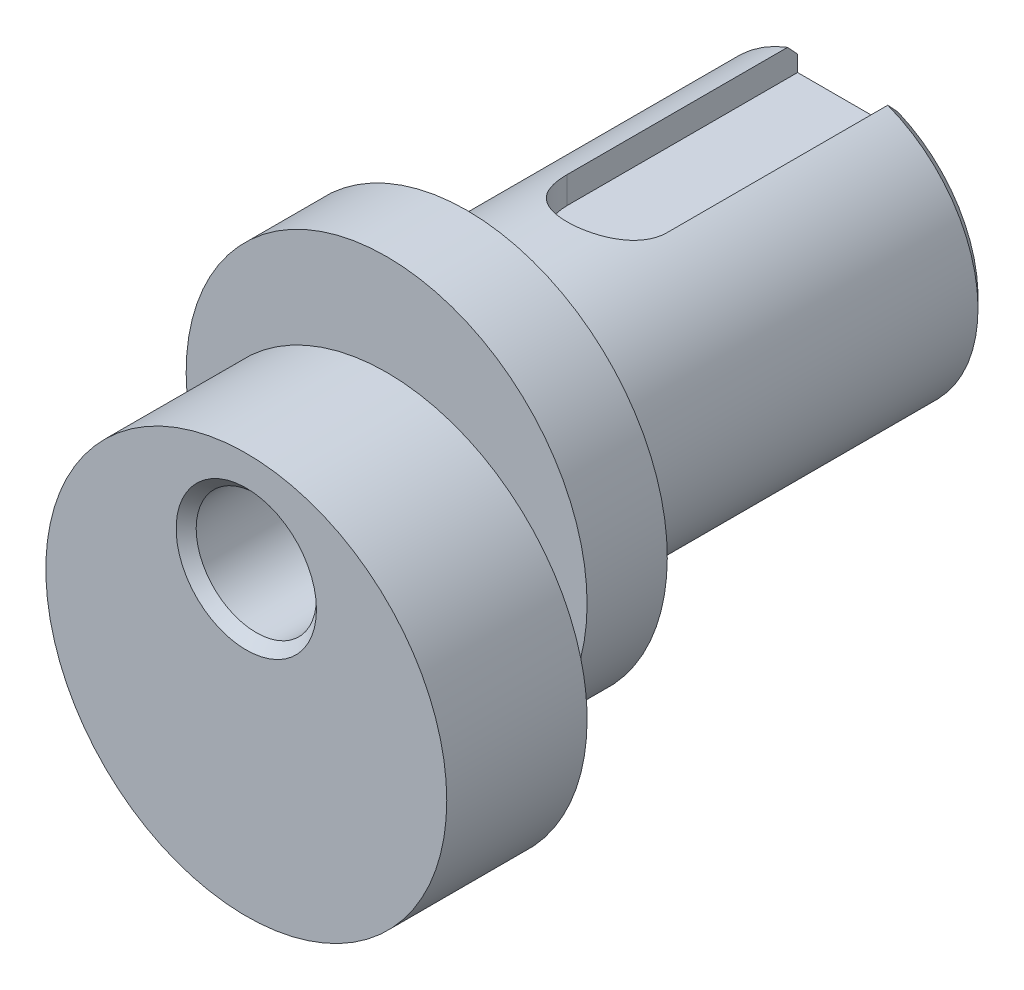
ISO-10303-21;
HEADER;
FILE_DESCRIPTION(('STEP AP214'),'2;1');
FILE_NAME('part.step','',(''),(''),'','','');
FILE_SCHEMA(('AUTOMOTIVE_DESIGN { 1 0 10303 214 1 1 1 1 }'));
ENDSEC;
DATA;
#1=APPLICATION_CONTEXT('core data for automotive mechanical design processes');
#2=APPLICATION_PROTOCOL_DEFINITION('international standard','automotive_design',2000,#1);
#3=PRODUCT_CONTEXT('',#1,'mechanical');
#4=PRODUCT('Part','Part','',(#3));
#5=PRODUCT_RELATED_PRODUCT_CATEGORY('part','',(#4));
#6=PRODUCT_DEFINITION_FORMATION('','',#4);
#7=PRODUCT_DEFINITION_CONTEXT('part definition',#1,'design');
#8=PRODUCT_DEFINITION('design','',#6,#7);
#9=PRODUCT_DEFINITION_SHAPE('','',#8);
#10=(LENGTH_UNIT() NAMED_UNIT(*) SI_UNIT(.MILLI.,.METRE.));
#11=(NAMED_UNIT(*) PLANE_ANGLE_UNIT() SI_UNIT($,.RADIAN.));
#12=(NAMED_UNIT(*) SI_UNIT($,.STERADIAN.) SOLID_ANGLE_UNIT());
#13=UNCERTAINTY_MEASURE_WITH_UNIT(LENGTH_MEASURE(1.E-05),#10,'distance_accuracy_value','');
#14=(GEOMETRIC_REPRESENTATION_CONTEXT(3) GLOBAL_UNCERTAINTY_ASSIGNED_CONTEXT((#13)) GLOBAL_UNIT_ASSIGNED_CONTEXT((#10,
#11,#12)) REPRESENTATION_CONTEXT('',''));
#15=CARTESIAN_POINT('',(0.,0.,0.));
#16=DIRECTION('',(0.,0.,1.));
#17=DIRECTION('',(1.,0.,0.));
#18=AXIS2_PLACEMENT_3D('',#15,#16,#17);
#19=CARTESIAN_POINT('',(0.,5.,-30.));
#20=DIRECTION('',(0.,0.,1.));
#21=DIRECTION('',(1.,0.,0.));
#22=AXIS2_PLACEMENT_3D('',#19,#20,#21);
#23=CYLINDRICAL_SURFACE('',#22,7.);
#24=CARTESIAN_POINT('',(0.,5.,-11.));
#25=DIRECTION('',(0.,0.,-1.));
#26=DIRECTION('',(-1.,0.,0.));
#27=AXIS2_PLACEMENT_3D('',#24,#25,#26);
#28=CIRCLE('',#27,7.);
#29=CARTESIAN_POINT('',(-7.,5.,-11.));
#30=VERTEX_POINT('',#29);
#31=EDGE_CURVE('E125',#30,#30,#28,.T.);
#32=ORIENTED_EDGE('',*,*,#31,.T.);
#33=EDGE_LOOP('',(#32));
#34=FACE_BOUND('',#33,.T.);
#35=DIRECTION('',(0.,0.,1.));
#36=VECTOR('',#35,1.);
#37=CARTESIAN_POINT('',(-2.5,11.538348415311,-30.));
#38=LINE('',#37,#36);
#39=CARTESIAN_POINT('',(-2.5,11.538348415311,-29.5));
#40=VERTEX_POINT('',#39);
#41=CARTESIAN_POINT('',(-2.5,11.538348415311,-18.5));
#42=VERTEX_POINT('',#41);
#43=EDGE_CURVE('E99',#40,#42,#38,.T.);
#44=ORIENTED_EDGE('',*,*,#43,.F.);
#45=CARTESIAN_POINT('',(0.,5.,-29.5));
#46=DIRECTION('',(0.,0.,-1.));
#47=DIRECTION('',(-1.,0.,0.));
#48=AXIS2_PLACEMENT_3D('',#45,#46,#47);
#49=CIRCLE('',#48,7.);
#50=CARTESIAN_POINT('',(2.5,11.538348415311,-29.5));
#51=VERTEX_POINT('',#50);
#52=EDGE_CURVE('E56',#40,#51,#49,.F.);
#53=ORIENTED_EDGE('',*,*,#52,.T.);
#54=DIRECTION('',(0.,0.,1.));
#55=VECTOR('',#54,1.);
#56=CARTESIAN_POINT('',(2.5,11.538348415311,-30.));
#57=LINE('',#56,#55);
#58=CARTESIAN_POINT('',(2.5,11.538348415311,-18.5));
#59=VERTEX_POINT('',#58);
#60=EDGE_CURVE('E102',#59,#51,#57,.F.);
#61=ORIENTED_EDGE('',*,*,#60,.F.);
#62=CARTESIAN_POINT('',(-2.5,11.538348415311,-18.5));
#63=CARTESIAN_POINT('',(-2.50000932220903,11.5383365378513,-18.4321107542711));
#64=CARTESIAN_POINT('',(-2.49723485076694,11.5394054992274,-18.3642280673609));
#65=CARTESIAN_POINT('',(-2.4861910211816,11.5436165747813,-18.2289960893886));
#66=CARTESIAN_POINT('',(-2.47792334551208,11.5467580541806,-18.1616466413939));
#67=CARTESIAN_POINT('',(-2.456001752859,11.5550121763794,-18.0281785853972));
#68=CARTESIAN_POINT('',(-2.44236559963955,11.5601183170568,-17.9620566636602));
#69=CARTESIAN_POINT('',(-2.40985115466648,11.5721317785417,-17.8312981648915));
#70=CARTESIAN_POINT('',(-2.39097263107435,11.5790391790075,-17.7666616536876));
#71=CARTESIAN_POINT('',(-2.32673964179204,11.6021493436571,-17.5757356335225));
#72=CARTESIAN_POINT('',(-2.27375112606986,11.6207547534084,-17.4522095478644));
#73=CARTESIAN_POINT('',(-2.14910757865425,11.6622539736071,-17.215769666872));
#74=CARTESIAN_POINT('',(-2.07743895048849,11.6851509042488,-17.1028636832645));
#75=CARTESIAN_POINT('',(-1.9140257110197,11.7337991379222,-16.8857847866473));
#76=CARTESIAN_POINT('',(-1.82158337146744,11.7596286404137,-16.7821535248041));
#77=CARTESIAN_POINT('',(-1.6207338877633,11.8105759232303,-16.5914912952836));
#78=CARTESIAN_POINT('',(-1.51232377552673,11.8356935701987,-16.5044634207567));
#79=CARTESIAN_POINT('',(-1.27853915335934,11.8833113327905,-16.346910144545));
#80=CARTESIAN_POINT('',(-1.15274833789185,11.905708352238,-16.2769684781395));
#81=CARTESIAN_POINT('',(-0.890250825476634,11.9444235767263,-16.1594633532026));
#82=CARTESIAN_POINT('',(-0.753547890540326,11.9607438658547,-16.111892220954));
#83=CARTESIAN_POINT('',(-0.478829979256174,11.9849105051071,-16.0423593978176));
#84=CARTESIAN_POINT('',(-0.341079835227466,11.9930659435251,-16.0194608695289));
#85=CARTESIAN_POINT('',(-0.0634643052969033,12.0010879805382,-15.9969315972224));
#86=CARTESIAN_POINT('',(0.0764004845074484,12.000956873027,-15.9972944139654));
#87=CARTESIAN_POINT('',(0.347593258486945,11.9926225804908,-16.0207112737611));
#88=CARTESIAN_POINT('',(0.47902240707872,11.9847824358352,-16.0427447941985));
#89=CARTESIAN_POINT('',(0.736175812143607,11.9623783250735,-16.1071734241588));
#90=CARTESIAN_POINT('',(0.861899745780464,11.9478139789904,-16.1495696843625));
#91=CARTESIAN_POINT('',(1.10616102429807,11.9131650689037,-16.2540469115653));
#92=CARTESIAN_POINT('',(1.22457279066906,11.8930059216431,-16.3163957149601));
#93=CARTESIAN_POINT('',(1.44953531305523,11.8492335561632,-16.4587793352234));
#94=CARTESIAN_POINT('',(1.5560824517677,11.8256192895926,-16.5388195237836));
#95=CARTESIAN_POINT('',(1.7603244525607,11.7759054780549,-16.7193232636567));
#96=CARTESIAN_POINT('',(1.85724185700418,11.7497405584388,-16.8206497231449));
#97=CARTESIAN_POINT('',(2.03299914621296,11.6989034246898,-17.0383273641656));
#98=CARTESIAN_POINT('',(2.11183255456462,11.6742317476526,-17.1546839051685));
#99=CARTESIAN_POINT('',(2.25049860898459,11.628778038754,-17.401942598522));
#100=CARTESIAN_POINT('',(2.30994207989625,11.6080787511899,-17.5330789755054));
#101=CARTESIAN_POINT('',(2.4055543972585,11.5738821361027,-17.8043648015822));
#102=CARTESIAN_POINT('',(2.44176119399954,11.5603730716505,-17.944499141169));
#103=CARTESIAN_POINT('',(2.47705497148627,11.5470854224556,-18.1550305442642));
#104=CARTESIAN_POINT('',(2.48565347586445,11.5438201096791,-18.2237363017718));
#105=CARTESIAN_POINT('',(2.49712352174882,11.5394491082968,-18.3616151641917));
#106=CARTESIAN_POINT('',(2.50000139665367,11.5383410314094,-18.4307876671005));
#107=CARTESIAN_POINT('',(2.5,11.538348415311,-18.5));
#108=B_SPLINE_CURVE_WITH_KNOTS('',3,(#62,#63,#64,#65,#66,#67,#68,#69,#70,#71,#72,#73,#74,#75,
#76,#77,#78,#79,#80,#81,#82,#83,#84,#85,#86,#87,#88,#89,#90,#91,#92,#93,#94,#95,#96,#97,#98,#99,
#100,#101,#102,#103,#104,#105,#106,#107),.UNSPECIFIED.,.F.,.F.,(4,2,2,2,2,2,2,2,2,2,2,2,2,2,2,2,
2,2,2,2,2,2,4),(0.,0.203591628551589,0.407120929225528,0.609982356545745,0.812852756635989,
1.21793118555512,1.6233052814847,2.0451597231193,2.4670926781184,2.90188398965561,
3.33652604665238,3.75400993940861,4.17137826416922,4.56998920861347,4.96862268086888,
5.37284909448639,5.77719841367921,6.20315837945088,6.62927065674721,7.06347329058504,
7.49696496492444,7.70468580162772,7.91217653896403),.UNSPECIFIED.);
#109=EDGE_CURVE('E145',#42,#59,#108,.T.);
#110=ORIENTED_EDGE('',*,*,#109,.F.);
#111=EDGE_LOOP('',(#44,#53,#61,#110));
#112=FACE_BOUND('',#111,.T.);
#113=ADVANCED_FACE('F40',(#34,#112),#23,.T.);
#114=CARTESIAN_POINT('',(0.,5.,-30.));
#115=DIRECTION('',(0.,0.,-1.));
#116=DIRECTION('',(-1.,0.,0.));
#117=AXIS2_PLACEMENT_3D('',#114,#115,#116);
#118=PLANE('',#117);
#119=CARTESIAN_POINT('',(0.,5.,-30.));
#120=DIRECTION('',(0.,0.,-1.));
#121=DIRECTION('',(-1.,0.,0.));
#122=AXIS2_PLACEMENT_3D('',#119,#120,#121);
#123=CIRCLE('',#122,3.50000000000001);
#124=CARTESIAN_POINT('',(-3.50000000000001,5.,-30.));
#125=VERTEX_POINT('',#124);
#126=EDGE_CURVE('E11',#125,#125,#123,.F.);
#127=ORIENTED_EDGE('',*,*,#126,.T.);
#128=EDGE_LOOP('',(#127));
#129=FACE_BOUND('',#128,.T.);
#130=DIRECTION('',(0.,1.,0.));
#131=VECTOR('',#130,1.);
#132=CARTESIAN_POINT('',(2.5,5.,-30.));
#133=LINE('',#132,#131);
#134=CARTESIAN_POINT('',(2.5,10.2,-30.));
#135=VERTEX_POINT('',#134);
#136=CARTESIAN_POINT('',(2.5,11.,-30.));
#137=VERTEX_POINT('',#136);
#138=EDGE_CURVE('E128',#135,#137,#133,.T.);
#139=ORIENTED_EDGE('',*,*,#138,.T.);
#140=CARTESIAN_POINT('',(0.,5.,-30.));
#141=DIRECTION('',(0.,0.,-1.));
#142=DIRECTION('',(-1.,0.,0.));
#143=AXIS2_PLACEMENT_3D('',#140,#141,#142);
#144=CIRCLE('',#143,6.5);
#145=CARTESIAN_POINT('',(-2.5,11.,-30.));
#146=VERTEX_POINT('',#145);
#147=EDGE_CURVE('E153',#137,#146,#144,.T.);
#148=ORIENTED_EDGE('',*,*,#147,.T.);
#149=DIRECTION('',(0.,-1.,0.));
#150=VECTOR('',#149,1.);
#151=CARTESIAN_POINT('',(-2.5,5.,-30.));
#152=LINE('',#151,#150);
#153=CARTESIAN_POINT('',(-2.5,10.2,-30.));
#154=VERTEX_POINT('',#153);
#155=EDGE_CURVE('E143',#146,#154,#152,.T.);
#156=ORIENTED_EDGE('',*,*,#155,.T.);
#157=DIRECTION('',(-1.,0.,0.));
#158=VECTOR('',#157,1.);
#159=CARTESIAN_POINT('',(2.5,10.2,-30.));
#160=LINE('',#159,#158);
#161=EDGE_CURVE('E116',#135,#154,#160,.T.);
#162=ORIENTED_EDGE('',*,*,#161,.F.);
#163=EDGE_LOOP('',(#139,#148,#156,#162));
#164=FACE_BOUND('',#163,.T.);
#165=ADVANCED_FACE('F168',(#129,#164),#118,.T.);
#166=CARTESIAN_POINT('',(0.,0.,-7.));
#167=DIRECTION('',(0.,0.,1.));
#168=DIRECTION('',(1.,0.,0.));
#169=AXIS2_PLACEMENT_3D('',#166,#167,#168);
#170=CYLINDRICAL_SURFACE('',#169,10.);
#171=CARTESIAN_POINT('',(0.,0.,-7.));
#172=DIRECTION('',(0.,0.,1.));
#173=DIRECTION('',(1.,0.,0.));
#174=AXIS2_PLACEMENT_3D('',#171,#172,#173);
#175=CIRCLE('',#174,10.);
#176=CARTESIAN_POINT('',(9.68245836551854,2.5,-7.));
#177=VERTEX_POINT('',#176);
#178=CARTESIAN_POINT('',(-9.68245836551854,2.5,-7.));
#179=VERTEX_POINT('',#178);
#180=EDGE_CURVE('E129',#177,#179,#175,.T.);
#181=ORIENTED_EDGE('',*,*,#180,.T.);
#182=EDGE_CURVE('E138',#179,#177,#175,.T.);
#183=ORIENTED_EDGE('',*,*,#182,.T.);
#184=EDGE_LOOP('',(#181,#183));
#185=FACE_BOUND('',#184,.T.);
#186=CARTESIAN_POINT('',(0.,0.,0.));
#187=DIRECTION('',(0.,0.,1.));
#188=DIRECTION('',(1.,0.,0.));
#189=AXIS2_PLACEMENT_3D('',#186,#187,#188);
#190=CIRCLE('',#189,10.);
#191=CARTESIAN_POINT('',(10.,0.,0.));
#192=VERTEX_POINT('',#191);
#193=EDGE_CURVE('E133',#192,#192,#190,.T.);
#194=ORIENTED_EDGE('',*,*,#193,.F.);
#195=EDGE_LOOP('',(#194));
#196=FACE_BOUND('',#195,.T.);
#197=ADVANCED_FACE('F186',(#185,#196),#170,.T.);
#198=CARTESIAN_POINT('',(0.,0.,-7.));
#199=DIRECTION('',(0.,0.,1.));
#200=DIRECTION('',(1.,0.,0.));
#201=AXIS2_PLACEMENT_3D('',#198,#199,#200);
#202=PLANE('',#201);
#203=CARTESIAN_POINT('',(0.,5.,-7.));
#204=DIRECTION('',(0.,0.,-1.));
#205=DIRECTION('',(-1.,0.,0.));
#206=AXIS2_PLACEMENT_3D('',#203,#204,#205);
#207=CIRCLE('',#206,10.);
#208=EDGE_CURVE('E134',#177,#179,#207,.T.);
#209=ORIENTED_EDGE('',*,*,#208,.F.);
#210=ORIENTED_EDGE('',*,*,#182,.F.);
#211=EDGE_LOOP('',(#209,#210));
#212=FACE_BOUND('',#211,.T.);
#213=ADVANCED_FACE('F214',(#212),#202,.F.);
#214=CARTESIAN_POINT('',(0.,0.,0.));
#215=DIRECTION('',(0.,0.,1.));
#216=DIRECTION('',(1.,0.,0.));
#217=AXIS2_PLACEMENT_3D('',#214,#215,#216);
#218=PLANE('',#217);
#219=CARTESIAN_POINT('',(0.,5.,0.));
#220=DIRECTION('',(0.,0.,1.));
#221=DIRECTION('',(1.,0.,0.));
#222=AXIS2_PLACEMENT_3D('',#219,#220,#221);
#223=CIRCLE('',#222,3.5);
#224=CARTESIAN_POINT('',(3.5,5.,0.));
#225=VERTEX_POINT('',#224);
#226=EDGE_CURVE('E196',#225,#225,#223,.F.);
#227=ORIENTED_EDGE('',*,*,#226,.T.);
#228=EDGE_LOOP('',(#227));
#229=FACE_BOUND('',#228,.T.);
#230=ORIENTED_EDGE('',*,*,#193,.T.);
#231=EDGE_LOOP('',(#230));
#232=FACE_BOUND('',#231,.T.);
#233=ADVANCED_FACE('F210',(#229,#232),#218,.T.);
#234=CARTESIAN_POINT('',(0.,5.,-11.));
#235=DIRECTION('',(0.,0.,1.));
#236=DIRECTION('',(1.,0.,0.));
#237=AXIS2_PLACEMENT_3D('',#234,#235,#236);
#238=CYLINDRICAL_SURFACE('',#237,10.);
#239=CARTESIAN_POINT('',(0.,5.,-11.));
#240=DIRECTION('',(0.,0.,-1.));
#241=DIRECTION('',(-1.,0.,0.));
#242=AXIS2_PLACEMENT_3D('',#239,#240,#241);
#243=CIRCLE('',#242,10.);
#244=CARTESIAN_POINT('',(-10.,5.,-11.));
#245=VERTEX_POINT('',#244);
#246=EDGE_CURVE('E130',#245,#245,#243,.T.);
#247=ORIENTED_EDGE('',*,*,#246,.F.);
#248=EDGE_LOOP('',(#247));
#249=FACE_BOUND('',#248,.T.);
#250=ORIENTED_EDGE('',*,*,#208,.T.);
#251=EDGE_CURVE('E124',#179,#177,#207,.T.);
#252=ORIENTED_EDGE('',*,*,#251,.T.);
#253=EDGE_LOOP('',(#250,#252));
#254=FACE_BOUND('',#253,.T.);
#255=ADVANCED_FACE('F213',(#249,#254),#238,.T.);
#256=CARTESIAN_POINT('',(0.,5.,-11.));
#257=DIRECTION('',(0.,0.,-1.));
#258=DIRECTION('',(-1.,0.,0.));
#259=AXIS2_PLACEMENT_3D('',#256,#257,#258);
#260=PLANE('',#259);
#261=ORIENTED_EDGE('',*,*,#31,.F.);
#262=EDGE_LOOP('',(#261));
#263=FACE_BOUND('',#262,.T.);
#264=ORIENTED_EDGE('',*,*,#246,.T.);
#265=EDGE_LOOP('',(#264));
#266=FACE_BOUND('',#265,.T.);
#267=ADVANCED_FACE('F325',(#263,#266),#260,.T.);
#268=CARTESIAN_POINT('',(0.,5.,-7.));
#269=DIRECTION('',(0.,0.,-1.));
#270=DIRECTION('',(-1.,0.,0.));
#271=AXIS2_PLACEMENT_3D('',#268,#269,#270);
#272=PLANE('',#271);
#273=ORIENTED_EDGE('',*,*,#180,.F.);
#274=ORIENTED_EDGE('',*,*,#251,.F.);
#275=EDGE_LOOP('',(#273,#274));
#276=FACE_BOUND('',#275,.T.);
#277=ADVANCED_FACE('F162',(#276),#272,.F.);
#278=CARTESIAN_POINT('',(0.,20.4,-18.5));
#279=DIRECTION('',(0.,-1.,0.));
#280=DIRECTION('',(0.,0.,-1.));
#281=AXIS2_PLACEMENT_3D('',#278,#279,#280);
#282=CYLINDRICAL_SURFACE('',#281,2.5);
#283=ORIENTED_EDGE('',*,*,#109,.T.);
#284=DIRECTION('',(0.,-1.,0.));
#285=VECTOR('',#284,1.);
#286=CARTESIAN_POINT('',(2.5,20.4,-18.5));
#287=LINE('',#286,#285);
#288=CARTESIAN_POINT('',(2.5,10.2,-18.5));
#289=VERTEX_POINT('',#288);
#290=EDGE_CURVE('E103',#59,#289,#287,.T.);
#291=ORIENTED_EDGE('',*,*,#290,.T.);
#292=CARTESIAN_POINT('',(0.,10.2,-18.5));
#293=DIRECTION('',(0.,1.,0.));
#294=DIRECTION('',(0.,0.,1.));
#295=AXIS2_PLACEMENT_3D('',#292,#293,#294);
#296=CIRCLE('',#295,2.5);
#297=CARTESIAN_POINT('',(-2.5,10.2,-18.5));
#298=VERTEX_POINT('',#297);
#299=EDGE_CURVE('E106',#298,#289,#296,.T.);
#300=ORIENTED_EDGE('',*,*,#299,.F.);
#301=DIRECTION('',(0.,-1.,0.));
#302=VECTOR('',#301,1.);
#303=CARTESIAN_POINT('',(-2.5,20.4,-18.5));
#304=LINE('',#303,#302);
#305=EDGE_CURVE('E94',#42,#298,#304,.T.);
#306=ORIENTED_EDGE('',*,*,#305,.F.);
#307=EDGE_LOOP('',(#283,#291,#300,#306));
#308=FACE_BOUND('',#307,.T.);
#309=ADVANCED_FACE('F107',(#308),#282,.F.);
#310=CARTESIAN_POINT('',(-2.5,20.4,-18.5));
#311=DIRECTION('',(1.,0.,0.));
#312=DIRECTION('',(0.,0.,-1.));
#313=AXIS2_PLACEMENT_3D('',#310,#311,#312);
#314=PLANE('',#313);
#315=ORIENTED_EDGE('',*,*,#155,.F.);
#316=CARTESIAN_POINT('',(-2.5,11.,-30.));
#317=CARTESIAN_POINT('',(-2.5,11.0899698708667,-29.9169305883065));
#318=CARTESIAN_POINT('',(-2.5,11.1798171778274,-29.833729212444));
#319=CARTESIAN_POINT('',(-2.5,11.3592666495585,-29.6670625457351));
#320=CARTESIAN_POINT('',(-2.5,11.4488688143681,-29.5835972549309));
#321=CARTESIAN_POINT('',(-2.5,11.538348415311,-29.5));
#322=B_SPLINE_CURVE_WITH_KNOTS('',3,(#316,#317,#318,#319,#320,#321),.UNSPECIFIED.,.F.,.F.,(4,2,
4),(0.,0.367362311106639,0.734724563343169),.UNSPECIFIED.);
#323=EDGE_CURVE('E64',#146,#40,#322,.T.);
#324=ORIENTED_EDGE('',*,*,#323,.T.);
#325=ORIENTED_EDGE('',*,*,#43,.T.);
#326=ORIENTED_EDGE('',*,*,#305,.T.);
#327=DIRECTION('',(0.,0.,1.));
#328=VECTOR('',#327,1.);
#329=CARTESIAN_POINT('',(-2.5,10.2,-18.5));
#330=LINE('',#329,#328);
#331=EDGE_CURVE('E98',#154,#298,#330,.T.);
#332=ORIENTED_EDGE('',*,*,#331,.F.);
#333=EDGE_LOOP('',(#315,#324,#325,#326,#332));
#334=FACE_BOUND('',#333,.T.);
#335=ADVANCED_FACE('F96',(#334),#314,.T.);
#336=CARTESIAN_POINT('',(2.5,20.4,-18.5));
#337=DIRECTION('',(-1.,0.,0.));
#338=DIRECTION('',(0.,0.,1.));
#339=AXIS2_PLACEMENT_3D('',#336,#337,#338);
#340=PLANE('',#339);
#341=ORIENTED_EDGE('',*,*,#60,.T.);
#342=CARTESIAN_POINT('',(2.5,11.538348415311,-29.5));
#343=CARTESIAN_POINT('',(2.5,11.4488688143681,-29.5835972549309));
#344=CARTESIAN_POINT('',(2.5,11.3592666495585,-29.6670625457351));
#345=CARTESIAN_POINT('',(2.5,11.1798171778274,-29.833729212444));
#346=CARTESIAN_POINT('',(2.5,11.0899698708667,-29.9169305883065));
#347=CARTESIAN_POINT('',(2.5,11.,-30.));
#348=B_SPLINE_CURVE_WITH_KNOTS('',3,(#342,#343,#344,#345,#346,#347),.UNSPECIFIED.,.F.,.F.,(4,2,
4),(0.,0.36736225223653,0.734724563343169),.UNSPECIFIED.);
#349=EDGE_CURVE('E190',#51,#137,#348,.T.);
#350=ORIENTED_EDGE('',*,*,#349,.T.);
#351=ORIENTED_EDGE('',*,*,#138,.F.);
#352=DIRECTION('',(0.,0.,-1.));
#353=VECTOR('',#352,1.);
#354=CARTESIAN_POINT('',(2.5,10.2,-18.5));
#355=LINE('',#354,#353);
#356=EDGE_CURVE('E111',#289,#135,#355,.T.);
#357=ORIENTED_EDGE('',*,*,#356,.F.);
#358=ORIENTED_EDGE('',*,*,#290,.F.);
#359=EDGE_LOOP('',(#341,#350,#351,#357,#358));
#360=FACE_BOUND('',#359,.T.);
#361=ADVANCED_FACE('F163',(#360),#340,.T.);
#362=CARTESIAN_POINT('',(0.,10.2,-18.5));
#363=DIRECTION('',(0.,1.,0.));
#364=DIRECTION('',(0.,0.,1.));
#365=AXIS2_PLACEMENT_3D('',#362,#363,#364);
#366=PLANE('',#365);
#367=ORIENTED_EDGE('',*,*,#331,.T.);
#368=ORIENTED_EDGE('',*,*,#299,.T.);
#369=ORIENTED_EDGE('',*,*,#356,.T.);
#370=ORIENTED_EDGE('',*,*,#161,.T.);
#371=EDGE_LOOP('',(#367,#368,#369,#370));
#372=FACE_BOUND('',#371,.T.);
#373=ADVANCED_FACE('F114',(#372),#366,.T.);
#374=CARTESIAN_POINT('',(0.,5.,-30.));
#375=DIRECTION('',(0.,0.,1.));
#376=DIRECTION('',(1.,0.,0.));
#377=AXIS2_PLACEMENT_3D('',#374,#375,#376);
#378=CONICAL_SURFACE('',#377,6.5,0.785398163397449);
#379=ORIENTED_EDGE('',*,*,#349,.F.);
#380=ORIENTED_EDGE('',*,*,#52,.F.);
#381=ORIENTED_EDGE('',*,*,#323,.F.);
#382=ORIENTED_EDGE('',*,*,#147,.F.);
#383=EDGE_LOOP('',(#379,#380,#381,#382));
#384=FACE_BOUND('',#383,.T.);
#385=ADVANCED_FACE('F177',(#384),#378,.T.);
#386=CARTESIAN_POINT('',(0.,5.,0.));
#387=DIRECTION('',(0.,0.,-1.));
#388=DIRECTION('',(-1.,0.,0.));
#389=AXIS2_PLACEMENT_3D('',#386,#387,#388);
#390=CYLINDRICAL_SURFACE('',#389,3.);
#391=CARTESIAN_POINT('',(0.,5.,-0.500000000000003));
#392=DIRECTION('',(0.,0.,1.));
#393=DIRECTION('',(1.,0.,0.));
#394=AXIS2_PLACEMENT_3D('',#391,#392,#393);
#395=CIRCLE('',#394,3.);
#396=CARTESIAN_POINT('',(3.,5.,-0.500000000000003));
#397=VERTEX_POINT('',#396);
#398=EDGE_CURVE('E49',#397,#397,#395,.T.);
#399=ORIENTED_EDGE('',*,*,#398,.T.);
#400=EDGE_LOOP('',(#399));
#401=FACE_BOUND('',#400,.T.);
#402=CARTESIAN_POINT('',(0.,5.,-29.5));
#403=DIRECTION('',(0.,0.,-1.));
#404=DIRECTION('',(-1.,0.,0.));
#405=AXIS2_PLACEMENT_3D('',#402,#403,#404);
#406=CIRCLE('',#405,3.);
#407=CARTESIAN_POINT('',(-3.,5.,-29.5));
#408=VERTEX_POINT('',#407);
#409=EDGE_CURVE('E199',#408,#408,#406,.T.);
#410=ORIENTED_EDGE('',*,*,#409,.T.);
#411=EDGE_LOOP('',(#410));
#412=FACE_BOUND('',#411,.T.);
#413=ADVANCED_FACE('F184',(#401,#412),#390,.F.);
#414=CARTESIAN_POINT('',(0.,5.,0.));
#415=DIRECTION('',(0.,0.,1.));
#416=DIRECTION('',(1.,0.,0.));
#417=AXIS2_PLACEMENT_3D('',#414,#415,#416);
#418=CONICAL_SURFACE('',#417,3.5,0.785398163397445);
#419=ORIENTED_EDGE('',*,*,#398,.F.);
#420=EDGE_LOOP('',(#419));
#421=FACE_BOUND('',#420,.T.);
#422=ORIENTED_EDGE('',*,*,#226,.F.);
#423=EDGE_LOOP('',(#422));
#424=FACE_BOUND('',#423,.T.);
#425=ADVANCED_FACE('F188',(#421,#424),#418,.F.);
#426=CARTESIAN_POINT('',(0.,5.,-29.5));
#427=DIRECTION('',(0.,0.,-1.));
#428=DIRECTION('',(-1.,0.,0.));
#429=AXIS2_PLACEMENT_3D('',#426,#427,#428);
#430=CONICAL_SURFACE('',#429,3.,0.785398163397458);
#431=ORIENTED_EDGE('',*,*,#126,.F.);
#432=EDGE_LOOP('',(#431));
#433=FACE_BOUND('',#432,.T.);
#434=ORIENTED_EDGE('',*,*,#409,.F.);
#435=EDGE_LOOP('',(#434));
#436=FACE_BOUND('',#435,.T.);
#437=ADVANCED_FACE('F43',(#433,#436),#430,.F.);
#438=CLOSED_SHELL('',(#113,#165,#197,#213,#233,#255,#267,#277,#309,#335,#361,#373,#385,#413,
#425,#437));
#439=MANIFOLD_SOLID_BREP('B2',#438);
#440=ADVANCED_BREP_SHAPE_REPRESENTATION('',(#18,#439),#14);
#441=SHAPE_DEFINITION_REPRESENTATION(#9,#440);
ENDSEC;
END-ISO-10303-21;
